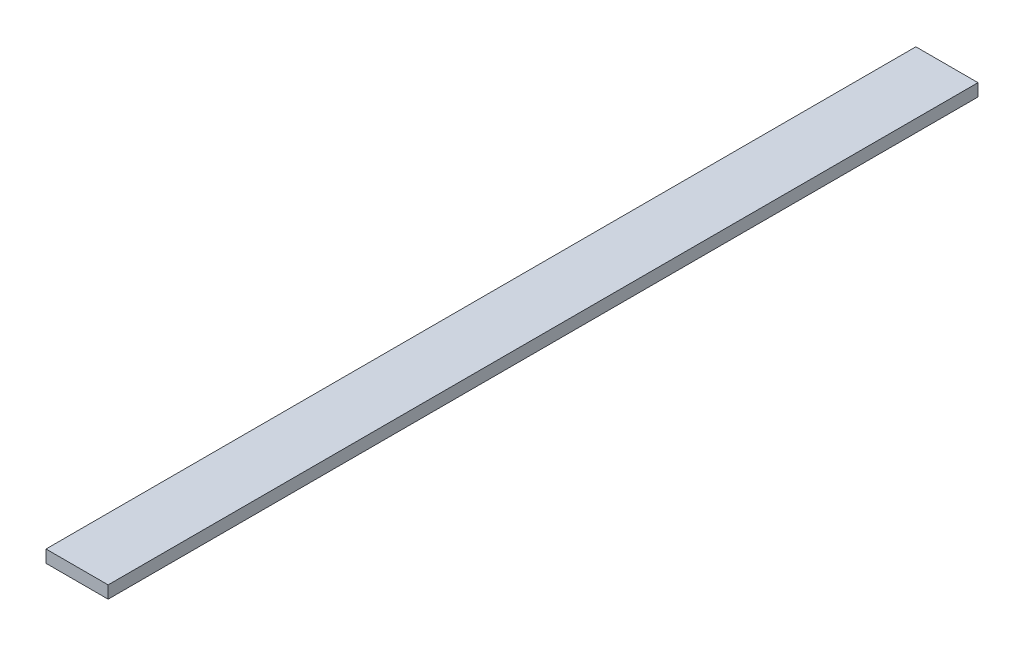
ISO-10303-21;
HEADER;
FILE_DESCRIPTION(('STEP AP214'),'2;1');
FILE_NAME('part.step','',(''),(''),'','','');
FILE_SCHEMA(('AUTOMOTIVE_DESIGN { 1 0 10303 214 1 1 1 1 }'));
ENDSEC;
DATA;
#1=APPLICATION_CONTEXT('core data for automotive mechanical design processes');
#2=APPLICATION_PROTOCOL_DEFINITION('international standard','automotive_design',2000,#1);
#3=PRODUCT_CONTEXT('',#1,'mechanical');
#4=PRODUCT('Part','Part','',(#3));
#5=PRODUCT_RELATED_PRODUCT_CATEGORY('part','',(#4));
#6=PRODUCT_DEFINITION_FORMATION('','',#4);
#7=PRODUCT_DEFINITION_CONTEXT('part definition',#1,'design');
#8=PRODUCT_DEFINITION('design','',#6,#7);
#9=PRODUCT_DEFINITION_SHAPE('','',#8);
#10=(LENGTH_UNIT() NAMED_UNIT(*) SI_UNIT(.MILLI.,.METRE.));
#11=(NAMED_UNIT(*) PLANE_ANGLE_UNIT() SI_UNIT($,.RADIAN.));
#12=(NAMED_UNIT(*) SI_UNIT($,.STERADIAN.) SOLID_ANGLE_UNIT());
#13=UNCERTAINTY_MEASURE_WITH_UNIT(LENGTH_MEASURE(1.E-05),#10,'distance_accuracy_value','');
#14=(GEOMETRIC_REPRESENTATION_CONTEXT(3) GLOBAL_UNCERTAINTY_ASSIGNED_CONTEXT((#13)) GLOBAL_UNIT_ASSIGNED_CONTEXT((#10,
#11,#12)) REPRESENTATION_CONTEXT('',''));
#15=CARTESIAN_POINT('',(0.,0.,0.));
#16=DIRECTION('',(0.,0.,1.));
#17=DIRECTION('',(1.,0.,0.));
#18=AXIS2_PLACEMENT_3D('',#15,#16,#17);
#19=CARTESIAN_POINT('',(12.5000000000001,5.,175.));
#20=DIRECTION('',(-1.,0.,0.));
#21=DIRECTION('',(0.,0.,1.));
#22=AXIS2_PLACEMENT_3D('',#19,#20,#21);
#23=PLANE('',#22);
#24=DIRECTION('',(0.,0.,-1.));
#25=VECTOR('',#24,1.);
#26=CARTESIAN_POINT('',(12.5000000000001,0.,175.));
#27=LINE('',#26,#25);
#28=CARTESIAN_POINT('',(12.5000000000001,0.,175.));
#29=VERTEX_POINT('',#28);
#30=CARTESIAN_POINT('',(12.5000000000001,0.,-175.));
#31=VERTEX_POINT('',#30);
#32=EDGE_CURVE('E113',#29,#31,#27,.T.);
#33=ORIENTED_EDGE('',*,*,#32,.T.);
#34=DIRECTION('',(0.,-1.,0.));
#35=VECTOR('',#34,1.);
#36=CARTESIAN_POINT('',(12.5000000000001,5.,-175.));
#37=LINE('',#36,#35);
#38=CARTESIAN_POINT('',(12.5000000000001,5.,-175.));
#39=VERTEX_POINT('',#38);
#40=EDGE_CURVE('E11',#39,#31,#37,.T.);
#41=ORIENTED_EDGE('',*,*,#40,.F.);
#42=DIRECTION('',(0.,0.,-1.));
#43=VECTOR('',#42,1.);
#44=CARTESIAN_POINT('',(12.5000000000001,5.,175.));
#45=LINE('',#44,#43);
#46=CARTESIAN_POINT('',(12.5000000000001,5.,175.));
#47=VERTEX_POINT('',#46);
#48=EDGE_CURVE('E97',#47,#39,#45,.T.);
#49=ORIENTED_EDGE('',*,*,#48,.F.);
#50=DIRECTION('',(0.,-1.,0.));
#51=VECTOR('',#50,1.);
#52=CARTESIAN_POINT('',(12.5000000000001,5.,175.));
#53=LINE('',#52,#51);
#54=EDGE_CURVE('E109',#47,#29,#53,.T.);
#55=ORIENTED_EDGE('',*,*,#54,.T.);
#56=EDGE_LOOP('',(#33,#41,#49,#55));
#57=FACE_BOUND('',#56,.T.);
#58=ADVANCED_FACE('F45',(#57),#23,.F.);
#59=CARTESIAN_POINT('',(-12.4999999999999,5.,-175.));
#60=DIRECTION('',(0.,0.,1.));
#61=DIRECTION('',(1.,0.,0.));
#62=AXIS2_PLACEMENT_3D('',#59,#60,#61);
#63=PLANE('',#62);
#64=DIRECTION('',(-1.,0.,0.));
#65=VECTOR('',#64,1.);
#66=CARTESIAN_POINT('',(-12.4999999999999,0.,-175.));
#67=LINE('',#66,#65);
#68=CARTESIAN_POINT('',(-12.4999999999999,0.,-175.));
#69=VERTEX_POINT('',#68);
#70=EDGE_CURVE('E102',#31,#69,#67,.T.);
#71=ORIENTED_EDGE('',*,*,#70,.T.);
#72=DIRECTION('',(0.,-1.,0.));
#73=VECTOR('',#72,1.);
#74=CARTESIAN_POINT('',(-12.4999999999999,5.,-175.));
#75=LINE('',#74,#73);
#76=CARTESIAN_POINT('',(-12.4999999999999,5.,-175.));
#77=VERTEX_POINT('',#76);
#78=EDGE_CURVE('E54',#77,#69,#75,.T.);
#79=ORIENTED_EDGE('',*,*,#78,.F.);
#80=DIRECTION('',(-1.,0.,0.));
#81=VECTOR('',#80,1.);
#82=CARTESIAN_POINT('',(-12.4999999999999,5.,-175.));
#83=LINE('',#82,#81);
#84=EDGE_CURVE('E92',#39,#77,#83,.T.);
#85=ORIENTED_EDGE('',*,*,#84,.F.);
#86=ORIENTED_EDGE('',*,*,#40,.T.);
#87=EDGE_LOOP('',(#71,#79,#85,#86));
#88=FACE_BOUND('',#87,.T.);
#89=ADVANCED_FACE('F101',(#88),#63,.F.);
#90=CARTESIAN_POINT('',(-12.5000000000001,5.,175.));
#91=DIRECTION('',(1.,0.,0.));
#92=DIRECTION('',(0.,0.,-1.));
#93=AXIS2_PLACEMENT_3D('',#90,#91,#92);
#94=PLANE('',#93);
#95=DIRECTION('',(0.,0.,1.));
#96=VECTOR('',#95,1.);
#97=CARTESIAN_POINT('',(-12.5000000000001,0.,175.));
#98=LINE('',#97,#96);
#99=CARTESIAN_POINT('',(-12.5000000000001,0.,175.));
#100=VERTEX_POINT('',#99);
#101=EDGE_CURVE('E79',#69,#100,#98,.T.);
#102=ORIENTED_EDGE('',*,*,#101,.T.);
#103=DIRECTION('',(0.,-1.,0.));
#104=VECTOR('',#103,1.);
#105=CARTESIAN_POINT('',(-12.5000000000001,5.,175.));
#106=LINE('',#105,#104);
#107=CARTESIAN_POINT('',(-12.5000000000001,5.,175.));
#108=VERTEX_POINT('',#107);
#109=EDGE_CURVE('E104',#108,#100,#106,.T.);
#110=ORIENTED_EDGE('',*,*,#109,.F.);
#111=DIRECTION('',(0.,0.,1.));
#112=VECTOR('',#111,1.);
#113=CARTESIAN_POINT('',(-12.5000000000001,5.,175.));
#114=LINE('',#113,#112);
#115=EDGE_CURVE('E95',#77,#108,#114,.T.);
#116=ORIENTED_EDGE('',*,*,#115,.F.);
#117=ORIENTED_EDGE('',*,*,#78,.T.);
#118=EDGE_LOOP('',(#102,#110,#116,#117));
#119=FACE_BOUND('',#118,.T.);
#120=ADVANCED_FACE('F105',(#119),#94,.F.);
#121=CARTESIAN_POINT('',(-12.5000000000001,5.,175.));
#122=DIRECTION('',(0.,0.,-1.));
#123=DIRECTION('',(-1.,0.,0.));
#124=AXIS2_PLACEMENT_3D('',#121,#122,#123);
#125=PLANE('',#124);
#126=DIRECTION('',(1.,0.,0.));
#127=VECTOR('',#126,1.);
#128=CARTESIAN_POINT('',(-12.5000000000001,0.,175.));
#129=LINE('',#128,#127);
#130=EDGE_CURVE('E85',#100,#29,#129,.T.);
#131=ORIENTED_EDGE('',*,*,#130,.T.);
#132=ORIENTED_EDGE('',*,*,#54,.F.);
#133=DIRECTION('',(1.,0.,0.));
#134=VECTOR('',#133,1.);
#135=CARTESIAN_POINT('',(-12.5000000000001,5.,175.));
#136=LINE('',#135,#134);
#137=EDGE_CURVE('E62',#108,#47,#136,.T.);
#138=ORIENTED_EDGE('',*,*,#137,.F.);
#139=ORIENTED_EDGE('',*,*,#109,.T.);
#140=EDGE_LOOP('',(#131,#132,#138,#139));
#141=FACE_BOUND('',#140,.T.);
#142=ADVANCED_FACE('F126',(#141),#125,.F.);
#143=CARTESIAN_POINT('',(0.,5.,0.));
#144=DIRECTION('',(0.,-1.,0.));
#145=DIRECTION('',(0.,0.,-1.));
#146=AXIS2_PLACEMENT_3D('',#143,#144,#145);
#147=PLANE('',#146);
#148=ORIENTED_EDGE('',*,*,#48,.T.);
#149=ORIENTED_EDGE('',*,*,#84,.T.);
#150=ORIENTED_EDGE('',*,*,#115,.T.);
#151=ORIENTED_EDGE('',*,*,#137,.T.);
#152=EDGE_LOOP('',(#148,#149,#150,#151));
#153=FACE_BOUND('',#152,.T.);
#154=ADVANCED_FACE('F93',(#153),#147,.F.);
#155=CARTESIAN_POINT('',(0.,0.,0.));
#156=DIRECTION('',(0.,-1.,0.));
#157=DIRECTION('',(0.,0.,-1.));
#158=AXIS2_PLACEMENT_3D('',#155,#156,#157);
#159=PLANE('',#158);
#160=ORIENTED_EDGE('',*,*,#32,.F.);
#161=ORIENTED_EDGE('',*,*,#130,.F.);
#162=ORIENTED_EDGE('',*,*,#101,.F.);
#163=ORIENTED_EDGE('',*,*,#70,.F.);
#164=EDGE_LOOP('',(#160,#161,#162,#163));
#165=FACE_BOUND('',#164,.T.);
#166=ADVANCED_FACE('F129',(#165),#159,.T.);
#167=CLOSED_SHELL('',(#58,#89,#120,#142,#154,#166));
#168=MANIFOLD_SOLID_BREP('B2',#167);
#169=ADVANCED_BREP_SHAPE_REPRESENTATION('',(#18,#168),#14);
#170=SHAPE_DEFINITION_REPRESENTATION(#9,#169);
ENDSEC;
END-ISO-10303-21;
